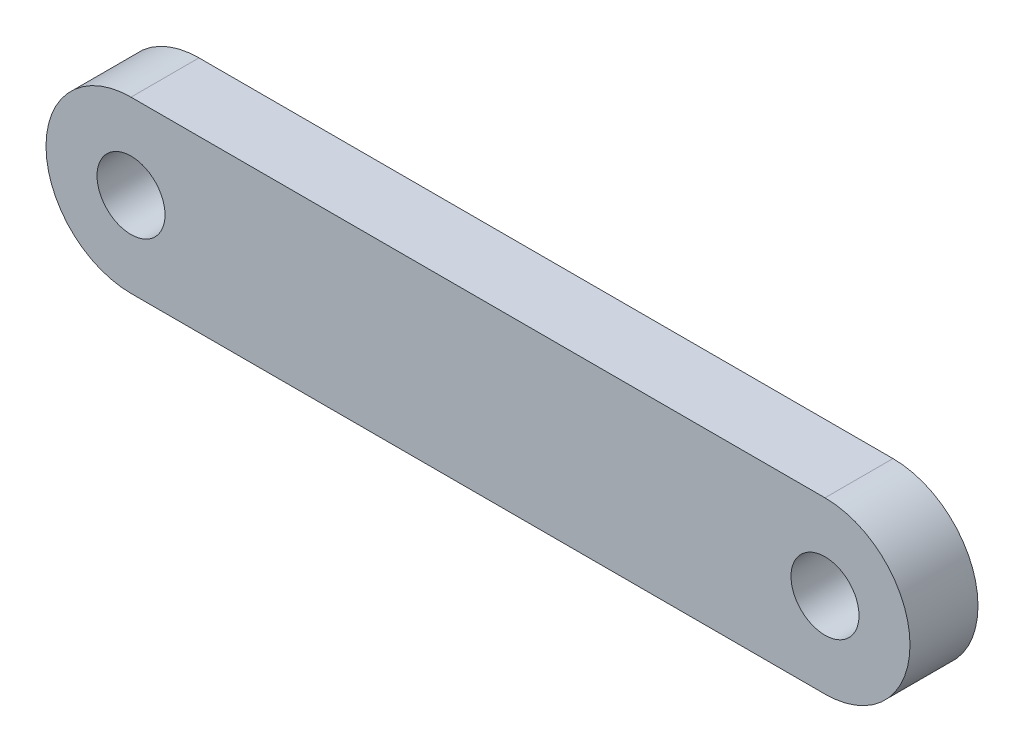
ISO-10303-21;
HEADER;
FILE_DESCRIPTION(('STEP AP214'),'2;1');
FILE_NAME('part.step','',(''),(''),'','','');
FILE_SCHEMA(('AUTOMOTIVE_DESIGN { 1 0 10303 214 1 1 1 1 }'));
ENDSEC;
DATA;
#1=APPLICATION_CONTEXT('core data for automotive mechanical design processes');
#2=APPLICATION_PROTOCOL_DEFINITION('international standard','automotive_design',2000,#1);
#3=PRODUCT_CONTEXT('',#1,'mechanical');
#4=PRODUCT('Part','Part','',(#3));
#5=PRODUCT_RELATED_PRODUCT_CATEGORY('part','',(#4));
#6=PRODUCT_DEFINITION_FORMATION('','',#4);
#7=PRODUCT_DEFINITION_CONTEXT('part definition',#1,'design');
#8=PRODUCT_DEFINITION('design','',#6,#7);
#9=PRODUCT_DEFINITION_SHAPE('','',#8);
#10=(LENGTH_UNIT() NAMED_UNIT(*) SI_UNIT(.MILLI.,.METRE.));
#11=(NAMED_UNIT(*) PLANE_ANGLE_UNIT() SI_UNIT($,.RADIAN.));
#12=(NAMED_UNIT(*) SI_UNIT($,.STERADIAN.) SOLID_ANGLE_UNIT());
#13=UNCERTAINTY_MEASURE_WITH_UNIT(LENGTH_MEASURE(1.E-05),#10,'distance_accuracy_value','');
#14=(GEOMETRIC_REPRESENTATION_CONTEXT(3) GLOBAL_UNCERTAINTY_ASSIGNED_CONTEXT((#13)) GLOBAL_UNIT_ASSIGNED_CONTEXT((#10,
#11,#12)) REPRESENTATION_CONTEXT('',''));
#15=CARTESIAN_POINT('',(0.,0.,0.));
#16=DIRECTION('',(0.,0.,1.));
#17=DIRECTION('',(1.,0.,0.));
#18=AXIS2_PLACEMENT_3D('',#15,#16,#17);
#19=CARTESIAN_POINT('',(0.,0.,2.54));
#20=DIRECTION('',(0.,0.,-1.));
#21=DIRECTION('',(-1.,0.,0.));
#22=AXIS2_PLACEMENT_3D('',#19,#20,#21);
#23=CYLINDRICAL_SURFACE('',#22,3.175);
#24=CARTESIAN_POINT('',(0.,0.,0.));
#25=DIRECTION('',(0.,0.,1.));
#26=DIRECTION('',(1.,0.,0.));
#27=AXIS2_PLACEMENT_3D('',#24,#25,#26);
#28=CIRCLE('',#27,3.175);
#29=CARTESIAN_POINT('',(0.,3.175,0.));
#30=VERTEX_POINT('',#29);
#31=CARTESIAN_POINT('',(0.,-3.175,0.));
#32=VERTEX_POINT('',#31);
#33=EDGE_CURVE('E110',#30,#32,#28,.T.);
#34=ORIENTED_EDGE('',*,*,#33,.T.);
#35=DIRECTION('',(0.,0.,-1.));
#36=VECTOR('',#35,1.);
#37=CARTESIAN_POINT('',(0.,-3.175,2.54));
#38=LINE('',#37,#36);
#39=CARTESIAN_POINT('',(0.,-3.175,2.54));
#40=VERTEX_POINT('',#39);
#41=EDGE_CURVE('E11',#40,#32,#38,.T.);
#42=ORIENTED_EDGE('',*,*,#41,.F.);
#43=CARTESIAN_POINT('',(0.,0.,2.54));
#44=DIRECTION('',(0.,0.,1.));
#45=DIRECTION('',(1.,0.,0.));
#46=AXIS2_PLACEMENT_3D('',#43,#44,#45);
#47=CIRCLE('',#46,3.175);
#48=CARTESIAN_POINT('',(0.,3.175,2.54));
#49=VERTEX_POINT('',#48);
#50=EDGE_CURVE('E90',#49,#40,#47,.T.);
#51=ORIENTED_EDGE('',*,*,#50,.F.);
#52=DIRECTION('',(0.,0.,-1.));
#53=VECTOR('',#52,1.);
#54=CARTESIAN_POINT('',(0.,3.175,2.54));
#55=LINE('',#54,#53);
#56=EDGE_CURVE('E56',#49,#30,#55,.T.);
#57=ORIENTED_EDGE('',*,*,#56,.T.);
#58=EDGE_LOOP('',(#34,#42,#51,#57));
#59=FACE_BOUND('',#58,.T.);
#60=ADVANCED_FACE('F39',(#59),#23,.T.);
#61=CARTESIAN_POINT('',(0.,-3.175,2.54));
#62=DIRECTION('',(0.,1.,0.));
#63=DIRECTION('',(0.,0.,1.));
#64=AXIS2_PLACEMENT_3D('',#61,#62,#63);
#65=PLANE('',#64);
#66=DIRECTION('',(1.,0.,0.));
#67=VECTOR('',#66,1.);
#68=CARTESIAN_POINT('',(0.,-3.175,0.));
#69=LINE('',#68,#67);
#70=CARTESIAN_POINT('',(25.9207,-3.175,0.));
#71=VERTEX_POINT('',#70);
#72=EDGE_CURVE('E95',#32,#71,#69,.T.);
#73=ORIENTED_EDGE('',*,*,#72,.T.);
#74=DIRECTION('',(0.,0.,-1.));
#75=VECTOR('',#74,1.);
#76=CARTESIAN_POINT('',(25.9207,-3.175,2.54));
#77=LINE('',#76,#75);
#78=CARTESIAN_POINT('',(25.9207,-3.175,2.54));
#79=VERTEX_POINT('',#78);
#80=EDGE_CURVE('E48',#79,#71,#77,.T.);
#81=ORIENTED_EDGE('',*,*,#80,.F.);
#82=DIRECTION('',(1.,0.,0.));
#83=VECTOR('',#82,1.);
#84=CARTESIAN_POINT('',(0.,-3.175,2.54));
#85=LINE('',#84,#83);
#86=EDGE_CURVE('E82',#40,#79,#85,.T.);
#87=ORIENTED_EDGE('',*,*,#86,.F.);
#88=ORIENTED_EDGE('',*,*,#41,.T.);
#89=EDGE_LOOP('',(#73,#81,#87,#88));
#90=FACE_BOUND('',#89,.T.);
#91=ADVANCED_FACE('F94',(#90),#65,.F.);
#92=CARTESIAN_POINT('',(25.9207,0.,2.54));
#93=DIRECTION('',(0.,0.,-1.));
#94=DIRECTION('',(-1.,0.,0.));
#95=AXIS2_PLACEMENT_3D('',#92,#93,#94);
#96=CYLINDRICAL_SURFACE('',#95,3.17500000000001);
#97=CARTESIAN_POINT('',(25.9207,0.,0.));
#98=DIRECTION('',(0.,0.,1.));
#99=DIRECTION('',(1.,0.,0.));
#100=AXIS2_PLACEMENT_3D('',#97,#98,#99);
#101=CIRCLE('',#100,3.17500000000001);
#102=CARTESIAN_POINT('',(25.9207,3.175,0.));
#103=VERTEX_POINT('',#102);
#104=EDGE_CURVE('E113',#71,#103,#101,.T.);
#105=ORIENTED_EDGE('',*,*,#104,.T.);
#106=DIRECTION('',(0.,0.,-1.));
#107=VECTOR('',#106,1.);
#108=CARTESIAN_POINT('',(25.9207,3.175,2.54));
#109=LINE('',#108,#107);
#110=CARTESIAN_POINT('',(25.9207,3.175,2.54));
#111=VERTEX_POINT('',#110);
#112=EDGE_CURVE('E71',#111,#103,#109,.T.);
#113=ORIENTED_EDGE('',*,*,#112,.F.);
#114=CARTESIAN_POINT('',(25.9207,0.,2.54));
#115=DIRECTION('',(0.,0.,1.));
#116=DIRECTION('',(1.,0.,0.));
#117=AXIS2_PLACEMENT_3D('',#114,#115,#116);
#118=CIRCLE('',#117,3.17500000000001);
#119=EDGE_CURVE('E89',#79,#111,#118,.T.);
#120=ORIENTED_EDGE('',*,*,#119,.F.);
#121=ORIENTED_EDGE('',*,*,#80,.T.);
#122=EDGE_LOOP('',(#105,#113,#120,#121));
#123=FACE_BOUND('',#122,.T.);
#124=ADVANCED_FACE('F98',(#123),#96,.T.);
#125=CARTESIAN_POINT('',(0.,3.175,2.54));
#126=DIRECTION('',(0.,1.,0.));
#127=DIRECTION('',(0.,0.,1.));
#128=AXIS2_PLACEMENT_3D('',#125,#126,#127);
#129=PLANE('',#128);
#130=DIRECTION('',(1.,0.,0.));
#131=VECTOR('',#130,1.);
#132=CARTESIAN_POINT('',(0.,3.175,0.));
#133=LINE('',#132,#131);
#134=EDGE_CURVE('E115',#30,#103,#133,.T.);
#135=ORIENTED_EDGE('',*,*,#134,.F.);
#136=ORIENTED_EDGE('',*,*,#56,.F.);
#137=DIRECTION('',(1.,0.,0.));
#138=VECTOR('',#137,1.);
#139=CARTESIAN_POINT('',(0.,3.175,2.54));
#140=LINE('',#139,#138);
#141=EDGE_CURVE('E99',#49,#111,#140,.T.);
#142=ORIENTED_EDGE('',*,*,#141,.T.);
#143=ORIENTED_EDGE('',*,*,#112,.T.);
#144=EDGE_LOOP('',(#135,#136,#142,#143));
#145=FACE_BOUND('',#144,.T.);
#146=ADVANCED_FACE('F151',(#145),#129,.T.);
#147=CARTESIAN_POINT('',(0.,0.,2.54));
#148=DIRECTION('',(0.,0.,-1.));
#149=DIRECTION('',(-1.,0.,0.));
#150=AXIS2_PLACEMENT_3D('',#147,#148,#149);
#151=CYLINDRICAL_SURFACE('',#150,1.27);
#152=CARTESIAN_POINT('',(0.,0.,2.54));
#153=DIRECTION('',(0.,0.,1.));
#154=DIRECTION('',(1.,0.,0.));
#155=AXIS2_PLACEMENT_3D('',#152,#153,#154);
#156=CIRCLE('',#155,1.27);
#157=CARTESIAN_POINT('',(1.27,0.,2.54));
#158=VERTEX_POINT('',#157);
#159=EDGE_CURVE('E121',#158,#158,#156,.T.);
#160=ORIENTED_EDGE('',*,*,#159,.T.);
#161=EDGE_LOOP('',(#160));
#162=FACE_BOUND('',#161,.T.);
#163=CARTESIAN_POINT('',(0.,0.,0.));
#164=DIRECTION('',(0.,0.,1.));
#165=DIRECTION('',(1.,0.,0.));
#166=AXIS2_PLACEMENT_3D('',#163,#164,#165);
#167=CIRCLE('',#166,1.27);
#168=CARTESIAN_POINT('',(1.27,0.,0.));
#169=VERTEX_POINT('',#168);
#170=EDGE_CURVE('E107',#169,#169,#167,.T.);
#171=ORIENTED_EDGE('',*,*,#170,.F.);
#172=EDGE_LOOP('',(#171));
#173=FACE_BOUND('',#172,.T.);
#174=ADVANCED_FACE('F41',(#162,#173),#151,.F.);
#175=CARTESIAN_POINT('',(25.9207,0.,2.54));
#176=DIRECTION('',(0.,0.,-1.));
#177=DIRECTION('',(-1.,0.,0.));
#178=AXIS2_PLACEMENT_3D('',#175,#176,#177);
#179=CYLINDRICAL_SURFACE('',#178,1.27);
#180=CARTESIAN_POINT('',(25.9207,0.,2.54));
#181=DIRECTION('',(0.,0.,1.));
#182=DIRECTION('',(1.,0.,0.));
#183=AXIS2_PLACEMENT_3D('',#180,#181,#182);
#184=CIRCLE('',#183,1.27);
#185=CARTESIAN_POINT('',(27.1907,0.,2.54));
#186=VERTEX_POINT('',#185);
#187=EDGE_CURVE('E101',#186,#186,#184,.T.);
#188=ORIENTED_EDGE('',*,*,#187,.T.);
#189=EDGE_LOOP('',(#188));
#190=FACE_BOUND('',#189,.T.);
#191=CARTESIAN_POINT('',(25.9207,0.,0.));
#192=DIRECTION('',(0.,0.,1.));
#193=DIRECTION('',(1.,0.,0.));
#194=AXIS2_PLACEMENT_3D('',#191,#192,#193);
#195=CIRCLE('',#194,1.27);
#196=CARTESIAN_POINT('',(27.1907,0.,0.));
#197=VERTEX_POINT('',#196);
#198=EDGE_CURVE('E118',#197,#197,#195,.T.);
#199=ORIENTED_EDGE('',*,*,#198,.F.);
#200=EDGE_LOOP('',(#199));
#201=FACE_BOUND('',#200,.T.);
#202=ADVANCED_FACE('F133',(#190,#201),#179,.F.);
#203=CARTESIAN_POINT('',(0.,0.,2.54));
#204=DIRECTION('',(0.,0.,1.));
#205=DIRECTION('',(1.,0.,0.));
#206=AXIS2_PLACEMENT_3D('',#203,#204,#205);
#207=PLANE('',#206);
#208=ORIENTED_EDGE('',*,*,#159,.F.);
#209=EDGE_LOOP('',(#208));
#210=FACE_BOUND('',#209,.T.);
#211=ORIENTED_EDGE('',*,*,#50,.T.);
#212=ORIENTED_EDGE('',*,*,#86,.T.);
#213=ORIENTED_EDGE('',*,*,#119,.T.);
#214=ORIENTED_EDGE('',*,*,#141,.F.);
#215=EDGE_LOOP('',(#211,#212,#213,#214));
#216=FACE_BOUND('',#215,.T.);
#217=ORIENTED_EDGE('',*,*,#187,.F.);
#218=EDGE_LOOP('',(#217));
#219=FACE_BOUND('',#218,.T.);
#220=ADVANCED_FACE('F85',(#210,#216,#219),#207,.T.);
#221=CARTESIAN_POINT('',(0.,0.,0.));
#222=DIRECTION('',(0.,0.,1.));
#223=DIRECTION('',(1.,0.,0.));
#224=AXIS2_PLACEMENT_3D('',#221,#222,#223);
#225=PLANE('',#224);
#226=ORIENTED_EDGE('',*,*,#170,.T.);
#227=EDGE_LOOP('',(#226));
#228=FACE_BOUND('',#227,.T.);
#229=ORIENTED_EDGE('',*,*,#33,.F.);
#230=ORIENTED_EDGE('',*,*,#134,.T.);
#231=ORIENTED_EDGE('',*,*,#104,.F.);
#232=ORIENTED_EDGE('',*,*,#72,.F.);
#233=EDGE_LOOP('',(#229,#230,#231,#232));
#234=FACE_BOUND('',#233,.T.);
#235=ORIENTED_EDGE('',*,*,#198,.T.);
#236=EDGE_LOOP('',(#235));
#237=FACE_BOUND('',#236,.T.);
#238=ADVANCED_FACE('F132',(#228,#234,#237),#225,.F.);
#239=CLOSED_SHELL('',(#60,#91,#124,#146,#174,#202,#220,#238));
#240=MANIFOLD_SOLID_BREP('B2',#239);
#241=ADVANCED_BREP_SHAPE_REPRESENTATION('',(#18,#240),#14);
#242=SHAPE_DEFINITION_REPRESENTATION(#9,#241);
ENDSEC;
END-ISO-10303-21;
